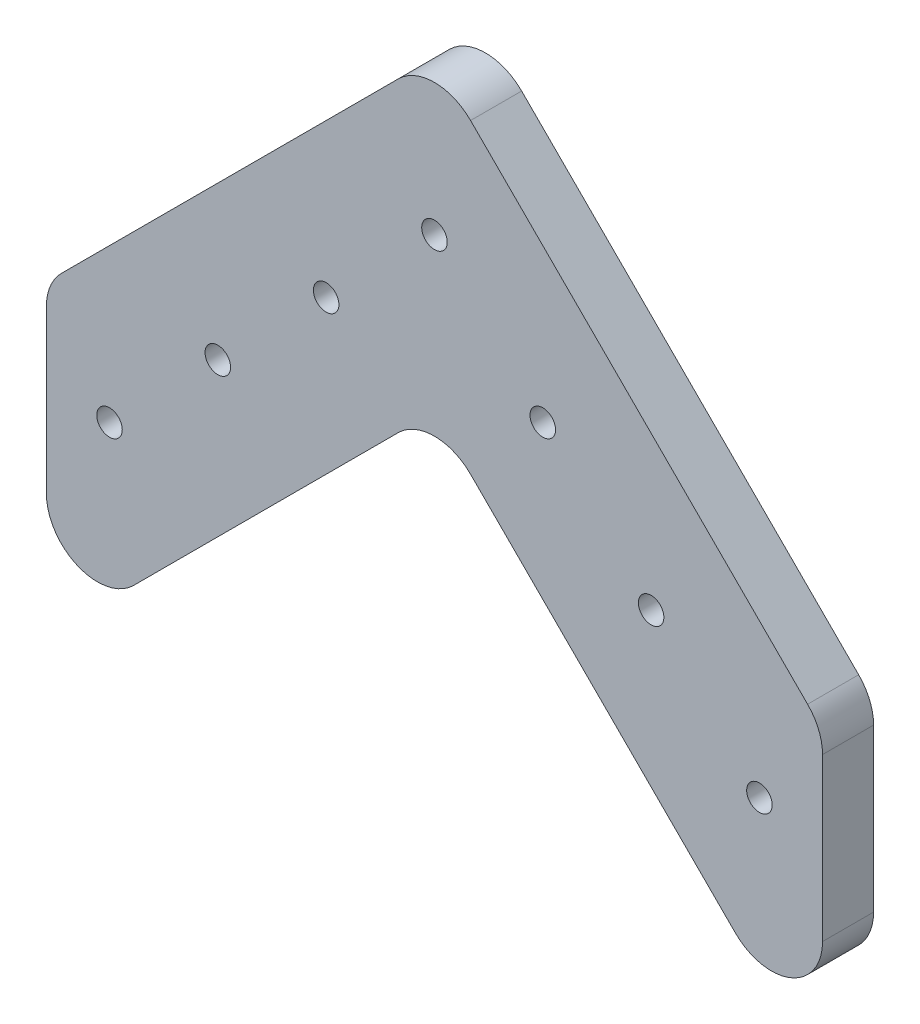
ISO-10303-21;
HEADER;
FILE_DESCRIPTION(('STEP AP214'),'2;1');
FILE_NAME('part.step','',(''),(''),'','','');
FILE_SCHEMA(('AUTOMOTIVE_DESIGN { 1 0 10303 214 1 1 1 1 }'));
ENDSEC;
DATA;
#1=APPLICATION_CONTEXT('core data for automotive mechanical design processes');
#2=APPLICATION_PROTOCOL_DEFINITION('international standard','automotive_design',2000,#1);
#3=PRODUCT_CONTEXT('',#1,'mechanical');
#4=PRODUCT('Part','Part','',(#3));
#5=PRODUCT_RELATED_PRODUCT_CATEGORY('part','',(#4));
#6=PRODUCT_DEFINITION_FORMATION('','',#4);
#7=PRODUCT_DEFINITION_CONTEXT('part definition',#1,'design');
#8=PRODUCT_DEFINITION('design','',#6,#7);
#9=PRODUCT_DEFINITION_SHAPE('','',#8);
#10=(LENGTH_UNIT() NAMED_UNIT(*) SI_UNIT(.MILLI.,.METRE.));
#11=(NAMED_UNIT(*) PLANE_ANGLE_UNIT() SI_UNIT($,.RADIAN.));
#12=(NAMED_UNIT(*) SI_UNIT($,.STERADIAN.) SOLID_ANGLE_UNIT());
#13=UNCERTAINTY_MEASURE_WITH_UNIT(LENGTH_MEASURE(1.E-05),#10,'distance_accuracy_value','');
#14=(GEOMETRIC_REPRESENTATION_CONTEXT(3) GLOBAL_UNCERTAINTY_ASSIGNED_CONTEXT((#13)) GLOBAL_UNIT_ASSIGNED_CONTEXT((#10,
#11,#12)) REPRESENTATION_CONTEXT('',''));
#15=CARTESIAN_POINT('',(0.,0.,0.));
#16=DIRECTION('',(0.,0.,1.));
#17=DIRECTION('',(1.,0.,0.));
#18=AXIS2_PLACEMENT_3D('',#15,#16,#17);
#19=CARTESIAN_POINT('',(0.,0.,5.));
#20=DIRECTION('',(0.,0.,-1.));
#21=DIRECTION('',(-1.,0.,0.));
#22=AXIS2_PLACEMENT_3D('',#19,#20,#21);
#23=PLANE('',#22);
#24=DIRECTION('',(0.,-1.,0.));
#25=VECTOR('',#24,1.);
#26=CARTESIAN_POINT('',(-38.,74.8284271247462,5.));
#27=LINE('',#26,#25);
#28=CARTESIAN_POINT('',(-38.,102.757359312881,5.));
#29=VERTEX_POINT('',#28);
#30=CARTESIAN_POINT('',(-38.,86.8994949366117,5.));
#31=VERTEX_POINT('',#30);
#32=EDGE_CURVE('E162',#29,#31,#27,.T.);
#33=ORIENTED_EDGE('',*,*,#32,.T.);
#34=CARTESIAN_POINT('',(-33.,86.8994949366117,5.));
#35=DIRECTION('',(0.,0.,-1.));
#36=DIRECTION('',(-1.,0.,0.));
#37=AXIS2_PLACEMENT_3D('',#34,#35,#36);
#38=CIRCLE('',#37,5.);
#39=CARTESIAN_POINT('',(-29.4644660940673,83.3639610306789,5.));
#40=VERTEX_POINT('',#39);
#41=EDGE_CURVE('E189',#31,#40,#38,.F.);
#42=ORIENTED_EDGE('',*,*,#41,.T.);
#43=DIRECTION('',(0.707106781186548,0.707106781186548,0.));
#44=VECTOR('',#43,1.);
#45=CARTESIAN_POINT('',(-38.,74.8284271247462,5.));
#46=LINE('',#45,#44);
#47=CARTESIAN_POINT('',(-3.53553390593272,109.292893218813,5.));
#48=VERTEX_POINT('',#47);
#49=EDGE_CURVE('E219',#40,#48,#46,.T.);
#50=ORIENTED_EDGE('',*,*,#49,.T.);
#51=CARTESIAN_POINT('',(0.,105.757359312881,5.));
#52=DIRECTION('',(0.,0.,-1.));
#53=DIRECTION('',(-1.,0.,0.));
#54=AXIS2_PLACEMENT_3D('',#51,#52,#53);
#55=CIRCLE('',#54,5.);
#56=CARTESIAN_POINT('',(3.53553390593273,109.292893218813,5.));
#57=VERTEX_POINT('',#56);
#58=EDGE_CURVE('E11',#48,#57,#55,.T.);
#59=ORIENTED_EDGE('',*,*,#58,.T.);
#60=DIRECTION('',(0.707106781186548,-0.707106781186547,0.));
#61=VECTOR('',#60,1.);
#62=CARTESIAN_POINT('',(38.,74.8284271247462,5.));
#63=LINE('',#62,#61);
#64=CARTESIAN_POINT('',(29.4644660940672,83.363961030679,5.));
#65=VERTEX_POINT('',#64);
#66=EDGE_CURVE('E140',#57,#65,#63,.T.);
#67=ORIENTED_EDGE('',*,*,#66,.T.);
#68=CARTESIAN_POINT('',(33.,86.8994949366117,5.));
#69=DIRECTION('',(0.,0.,-1.));
#70=DIRECTION('',(-1.,0.,0.));
#71=AXIS2_PLACEMENT_3D('',#68,#69,#70);
#72=CIRCLE('',#71,5.);
#73=CARTESIAN_POINT('',(38.,86.8994949366117,5.));
#74=VERTEX_POINT('',#73);
#75=EDGE_CURVE('E187',#65,#74,#72,.F.);
#76=ORIENTED_EDGE('',*,*,#75,.T.);
#77=DIRECTION('',(0.,1.,0.));
#78=VECTOR('',#77,1.);
#79=CARTESIAN_POINT('',(38.,74.8284271247462,5.));
#80=LINE('',#79,#78);
#81=CARTESIAN_POINT('',(38.,102.757359312881,5.));
#82=VERTEX_POINT('',#81);
#83=EDGE_CURVE('E228',#74,#82,#80,.T.);
#84=ORIENTED_EDGE('',*,*,#83,.T.);
#85=CARTESIAN_POINT('',(33.,102.757359312881,5.));
#86=DIRECTION('',(0.,0.,-1.));
#87=DIRECTION('',(-1.,0.,0.));
#88=AXIS2_PLACEMENT_3D('',#85,#86,#87);
#89=CIRCLE('',#88,5.);
#90=CARTESIAN_POINT('',(36.5355339059327,106.292893218813,5.));
#91=VERTEX_POINT('',#90);
#92=EDGE_CURVE('E185',#82,#91,#89,.F.);
#93=ORIENTED_EDGE('',*,*,#92,.T.);
#94=DIRECTION('',(-0.707106781186548,0.707106781186547,0.));
#95=VECTOR('',#94,1.);
#96=CARTESIAN_POINT('',(38.,104.828427124746,5.));
#97=LINE('',#96,#95);
#98=CARTESIAN_POINT('',(3.53553390593272,139.292893218813,5.));
#99=VERTEX_POINT('',#98);
#100=EDGE_CURVE('E231',#91,#99,#97,.T.);
#101=ORIENTED_EDGE('',*,*,#100,.T.);
#102=CARTESIAN_POINT('',(0.,135.757359312881,5.));
#103=DIRECTION('',(0.,0.,-1.));
#104=DIRECTION('',(-1.,0.,0.));
#105=AXIS2_PLACEMENT_3D('',#102,#103,#104);
#106=CIRCLE('',#105,5.);
#107=CARTESIAN_POINT('',(-3.53553390593276,139.292893218813,5.));
#108=VERTEX_POINT('',#107);
#109=EDGE_CURVE('E55',#99,#108,#106,.F.);
#110=ORIENTED_EDGE('',*,*,#109,.T.);
#111=DIRECTION('',(-0.707106781186547,-0.707106781186548,0.));
#112=VECTOR('',#111,1.);
#113=CARTESIAN_POINT('',(-38.,104.828427124746,5.));
#114=LINE('',#113,#112);
#115=CARTESIAN_POINT('',(-36.5355339059327,106.292893218813,5.));
#116=VERTEX_POINT('',#115);
#117=EDGE_CURVE('E163',#108,#116,#114,.T.);
#118=ORIENTED_EDGE('',*,*,#117,.T.);
#119=CARTESIAN_POINT('',(-33.,102.757359312881,5.));
#120=DIRECTION('',(0.,0.,-1.));
#121=DIRECTION('',(-1.,0.,0.));
#122=AXIS2_PLACEMENT_3D('',#119,#120,#121);
#123=CIRCLE('',#122,5.);
#124=EDGE_CURVE('E182',#116,#29,#123,.F.);
#125=ORIENTED_EDGE('',*,*,#124,.T.);
#126=EDGE_LOOP('',(#33,#42,#50,#59,#67,#76,#84,#93,#101,#110,#118,#125));
#127=FACE_BOUND('',#126,.T.);
#128=CARTESIAN_POINT('',(-31.8198051533946,96.0086219713515,5.));
#129=DIRECTION('',(0.,0.,1.));
#130=DIRECTION('',(1.,0.,0.));
#131=AXIS2_PLACEMENT_3D('',#128,#129,#130);
#132=CIRCLE('',#131,1.25);
#133=CARTESIAN_POINT('',(-30.5698051533946,96.0086219713515,5.));
#134=VERTEX_POINT('',#133);
#135=EDGE_CURVE('E233',#134,#134,#132,.T.);
#136=ORIENTED_EDGE('',*,*,#135,.F.);
#137=EDGE_LOOP('',(#136));
#138=FACE_BOUND('',#137,.T.);
#139=CARTESIAN_POINT('',(-21.2132034355964,106.61522368915,5.));
#140=DIRECTION('',(0.,0.,1.));
#141=DIRECTION('',(1.,0.,0.));
#142=AXIS2_PLACEMENT_3D('',#139,#140,#141);
#143=CIRCLE('',#142,1.25);
#144=CARTESIAN_POINT('',(-19.9632034355964,106.61522368915,5.));
#145=VERTEX_POINT('',#144);
#146=EDGE_CURVE('E238',#145,#145,#143,.T.);
#147=ORIENTED_EDGE('',*,*,#146,.F.);
#148=EDGE_LOOP('',(#147));
#149=FACE_BOUND('',#148,.T.);
#150=CARTESIAN_POINT('',(-10.6066017177982,117.221825406948,5.));
#151=DIRECTION('',(0.,0.,1.));
#152=DIRECTION('',(1.,0.,0.));
#153=AXIS2_PLACEMENT_3D('',#150,#151,#152);
#154=CIRCLE('',#153,1.25);
#155=CARTESIAN_POINT('',(-9.35660171779822,117.221825406948,5.));
#156=VERTEX_POINT('',#155);
#157=EDGE_CURVE('E243',#156,#156,#154,.T.);
#158=ORIENTED_EDGE('',*,*,#157,.F.);
#159=EDGE_LOOP('',(#158));
#160=FACE_BOUND('',#159,.T.);
#161=CARTESIAN_POINT('',(0.,127.828427124746,5.));
#162=DIRECTION('',(0.,0.,1.));
#163=DIRECTION('',(1.,0.,0.));
#164=AXIS2_PLACEMENT_3D('',#161,#162,#163);
#165=CIRCLE('',#164,1.25);
#166=CARTESIAN_POINT('',(1.25,127.828427124746,5.));
#167=VERTEX_POINT('',#166);
#168=EDGE_CURVE('E249',#167,#167,#165,.T.);
#169=ORIENTED_EDGE('',*,*,#168,.F.);
#170=EDGE_LOOP('',(#169));
#171=FACE_BOUND('',#170,.T.);
#172=CARTESIAN_POINT('',(10.6066017177982,117.221825406948,5.));
#173=DIRECTION('',(0.,0.,1.));
#174=DIRECTION('',(-1.,0.,0.));
#175=AXIS2_PLACEMENT_3D('',#172,#173,#174);
#176=CIRCLE('',#175,1.25);
#177=CARTESIAN_POINT('',(9.35660171779822,117.221825406948,5.));
#178=VERTEX_POINT('',#177);
#179=EDGE_CURVE('E255',#178,#178,#176,.T.);
#180=ORIENTED_EDGE('',*,*,#179,.F.);
#181=EDGE_LOOP('',(#180));
#182=FACE_BOUND('',#181,.T.);
#183=CARTESIAN_POINT('',(21.2132034355964,106.61522368915,5.));
#184=DIRECTION('',(0.,0.,1.));
#185=DIRECTION('',(-1.,0.,0.));
#186=AXIS2_PLACEMENT_3D('',#183,#184,#185);
#187=CIRCLE('',#186,1.25);
#188=CARTESIAN_POINT('',(19.9632034355964,106.61522368915,5.));
#189=VERTEX_POINT('',#188);
#190=EDGE_CURVE('E261',#189,#189,#187,.T.);
#191=ORIENTED_EDGE('',*,*,#190,.F.);
#192=EDGE_LOOP('',(#191));
#193=FACE_BOUND('',#192,.T.);
#194=CARTESIAN_POINT('',(31.8198051533946,96.0086219713515,5.));
#195=DIRECTION('',(0.,0.,1.));
#196=DIRECTION('',(-1.,0.,0.));
#197=AXIS2_PLACEMENT_3D('',#194,#195,#196);
#198=CIRCLE('',#197,1.25000000000001);
#199=CARTESIAN_POINT('',(30.5698051533946,96.0086219713515,5.));
#200=VERTEX_POINT('',#199);
#201=EDGE_CURVE('E267',#200,#200,#198,.T.);
#202=ORIENTED_EDGE('',*,*,#201,.F.);
#203=EDGE_LOOP('',(#202));
#204=FACE_BOUND('',#203,.T.);
#205=ADVANCED_FACE('F33',(#127,#138,#149,#160,#171,#182,#193,#204),#23,.F.);
#206=CARTESIAN_POINT('',(0.,0.,0.));
#207=DIRECTION('',(0.,0.,-1.));
#208=DIRECTION('',(-1.,0.,0.));
#209=AXIS2_PLACEMENT_3D('',#206,#207,#208);
#210=PLANE('',#209);
#211=CARTESIAN_POINT('',(21.2132034355964,106.61522368915,0.));
#212=DIRECTION('',(0.,0.,1.));
#213=DIRECTION('',(-1.,0.,0.));
#214=AXIS2_PLACEMENT_3D('',#211,#212,#213);
#215=CIRCLE('',#214,1.25);
#216=CARTESIAN_POINT('',(19.9632034355964,106.61522368915,0.));
#217=VERTEX_POINT('',#216);
#218=EDGE_CURVE('E264',#217,#217,#215,.T.);
#219=ORIENTED_EDGE('',*,*,#218,.T.);
#220=EDGE_LOOP('',(#219));
#221=FACE_BOUND('',#220,.T.);
#222=CARTESIAN_POINT('',(0.,127.828427124746,0.));
#223=DIRECTION('',(0.,0.,1.));
#224=DIRECTION('',(1.,0.,0.));
#225=AXIS2_PLACEMENT_3D('',#222,#223,#224);
#226=CIRCLE('',#225,1.25);
#227=CARTESIAN_POINT('',(1.25,127.828427124746,0.));
#228=VERTEX_POINT('',#227);
#229=EDGE_CURVE('E252',#228,#228,#226,.T.);
#230=ORIENTED_EDGE('',*,*,#229,.T.);
#231=EDGE_LOOP('',(#230));
#232=FACE_BOUND('',#231,.T.);
#233=CARTESIAN_POINT('',(-21.2132034355964,106.61522368915,0.));
#234=DIRECTION('',(0.,0.,1.));
#235=DIRECTION('',(1.,0.,0.));
#236=AXIS2_PLACEMENT_3D('',#233,#234,#235);
#237=CIRCLE('',#236,1.25);
#238=CARTESIAN_POINT('',(-19.9632034355964,106.61522368915,0.));
#239=VERTEX_POINT('',#238);
#240=EDGE_CURVE('E240',#239,#239,#237,.T.);
#241=ORIENTED_EDGE('',*,*,#240,.T.);
#242=EDGE_LOOP('',(#241));
#243=FACE_BOUND('',#242,.T.);
#244=DIRECTION('',(0.707106781186548,0.707106781186548,0.));
#245=VECTOR('',#244,1.);
#246=CARTESIAN_POINT('',(-38.,74.8284271247462,0.));
#247=LINE('',#246,#245);
#248=CARTESIAN_POINT('',(-29.4644660940673,83.3639610306789,0.));
#249=VERTEX_POINT('',#248);
#250=CARTESIAN_POINT('',(-3.53553390593272,109.292893218813,0.));
#251=VERTEX_POINT('',#250);
#252=EDGE_CURVE('E149',#249,#251,#247,.T.);
#253=ORIENTED_EDGE('',*,*,#252,.F.);
#254=CARTESIAN_POINT('',(-33.,86.8994949366117,0.));
#255=DIRECTION('',(0.,0.,-1.));
#256=DIRECTION('',(-1.,0.,0.));
#257=AXIS2_PLACEMENT_3D('',#254,#255,#256);
#258=CIRCLE('',#257,5.);
#259=CARTESIAN_POINT('',(-38.,86.8994949366117,0.));
#260=VERTEX_POINT('',#259);
#261=EDGE_CURVE('E175',#249,#260,#258,.T.);
#262=ORIENTED_EDGE('',*,*,#261,.T.);
#263=DIRECTION('',(0.,-1.,0.));
#264=VECTOR('',#263,1.);
#265=CARTESIAN_POINT('',(-38.,74.8284271247462,0.));
#266=LINE('',#265,#264);
#267=CARTESIAN_POINT('',(-38.,102.757359312881,0.));
#268=VERTEX_POINT('',#267);
#269=EDGE_CURVE('E154',#268,#260,#266,.T.);
#270=ORIENTED_EDGE('',*,*,#269,.F.);
#271=CARTESIAN_POINT('',(-33.,102.757359312881,0.));
#272=DIRECTION('',(0.,0.,-1.));
#273=DIRECTION('',(-1.,0.,0.));
#274=AXIS2_PLACEMENT_3D('',#271,#272,#273);
#275=CIRCLE('',#274,5.);
#276=CARTESIAN_POINT('',(-36.5355339059327,106.292893218813,0.));
#277=VERTEX_POINT('',#276);
#278=EDGE_CURVE('E168',#268,#277,#275,.T.);
#279=ORIENTED_EDGE('',*,*,#278,.T.);
#280=DIRECTION('',(-0.707106781186547,-0.707106781186548,0.));
#281=VECTOR('',#280,1.);
#282=CARTESIAN_POINT('',(-38.,104.828427124746,0.));
#283=LINE('',#282,#281);
#284=CARTESIAN_POINT('',(-3.53553390593276,139.292893218813,0.));
#285=VERTEX_POINT('',#284);
#286=EDGE_CURVE('E160',#285,#277,#283,.T.);
#287=ORIENTED_EDGE('',*,*,#286,.F.);
#288=CARTESIAN_POINT('',(0.,135.757359312881,0.));
#289=DIRECTION('',(0.,0.,-1.));
#290=DIRECTION('',(-1.,0.,0.));
#291=AXIS2_PLACEMENT_3D('',#288,#289,#290);
#292=CIRCLE('',#291,5.);
#293=CARTESIAN_POINT('',(3.53553390593272,139.292893218813,0.));
#294=VERTEX_POINT('',#293);
#295=EDGE_CURVE('E170',#285,#294,#292,.T.);
#296=ORIENTED_EDGE('',*,*,#295,.T.);
#297=DIRECTION('',(-0.707106781186548,0.707106781186547,0.));
#298=VECTOR('',#297,1.);
#299=CARTESIAN_POINT('',(38.,104.828427124746,0.));
#300=LINE('',#299,#298);
#301=CARTESIAN_POINT('',(36.5355339059327,106.292893218813,0.));
#302=VERTEX_POINT('',#301);
#303=EDGE_CURVE('E152',#302,#294,#300,.T.);
#304=ORIENTED_EDGE('',*,*,#303,.F.);
#305=CARTESIAN_POINT('',(33.,102.757359312881,0.));
#306=DIRECTION('',(0.,0.,-1.));
#307=DIRECTION('',(-1.,0.,0.));
#308=AXIS2_PLACEMENT_3D('',#305,#306,#307);
#309=CIRCLE('',#308,5.);
#310=CARTESIAN_POINT('',(38.,102.757359312881,0.));
#311=VERTEX_POINT('',#310);
#312=EDGE_CURVE('E172',#302,#311,#309,.T.);
#313=ORIENTED_EDGE('',*,*,#312,.T.);
#314=DIRECTION('',(0.,1.,0.));
#315=VECTOR('',#314,1.);
#316=CARTESIAN_POINT('',(38.,74.8284271247462,0.));
#317=LINE('',#316,#315);
#318=CARTESIAN_POINT('',(38.,86.8994949366117,0.));
#319=VERTEX_POINT('',#318);
#320=EDGE_CURVE('E148',#319,#311,#317,.T.);
#321=ORIENTED_EDGE('',*,*,#320,.F.);
#322=CARTESIAN_POINT('',(33.,86.8994949366117,0.));
#323=DIRECTION('',(0.,0.,-1.));
#324=DIRECTION('',(-1.,0.,0.));
#325=AXIS2_PLACEMENT_3D('',#322,#323,#324);
#326=CIRCLE('',#325,5.);
#327=CARTESIAN_POINT('',(29.4644660940672,83.363961030679,0.));
#328=VERTEX_POINT('',#327);
#329=EDGE_CURVE('E147',#319,#328,#326,.T.);
#330=ORIENTED_EDGE('',*,*,#329,.T.);
#331=DIRECTION('',(0.707106781186548,-0.707106781186547,0.));
#332=VECTOR('',#331,1.);
#333=CARTESIAN_POINT('',(38.,74.8284271247462,0.));
#334=LINE('',#333,#332);
#335=CARTESIAN_POINT('',(3.53553390593273,109.292893218813,0.));
#336=VERTEX_POINT('',#335);
#337=EDGE_CURVE('E137',#336,#328,#334,.T.);
#338=ORIENTED_EDGE('',*,*,#337,.F.);
#339=CARTESIAN_POINT('',(0.,105.757359312881,0.));
#340=DIRECTION('',(0.,0.,-1.));
#341=DIRECTION('',(-1.,0.,0.));
#342=AXIS2_PLACEMENT_3D('',#339,#340,#341);
#343=CIRCLE('',#342,5.);
#344=EDGE_CURVE('E41',#336,#251,#343,.F.);
#345=ORIENTED_EDGE('',*,*,#344,.T.);
#346=EDGE_LOOP('',(#253,#262,#270,#279,#287,#296,#304,#313,#321,#330,#338,#345));
#347=FACE_BOUND('',#346,.T.);
#348=CARTESIAN_POINT('',(-31.8198051533946,96.0086219713515,0.));
#349=DIRECTION('',(0.,0.,1.));
#350=DIRECTION('',(1.,0.,0.));
#351=AXIS2_PLACEMENT_3D('',#348,#349,#350);
#352=CIRCLE('',#351,1.25);
#353=CARTESIAN_POINT('',(-30.5698051533946,96.0086219713515,0.));
#354=VERTEX_POINT('',#353);
#355=EDGE_CURVE('E224',#354,#354,#352,.T.);
#356=ORIENTED_EDGE('',*,*,#355,.T.);
#357=EDGE_LOOP('',(#356));
#358=FACE_BOUND('',#357,.T.);
#359=CARTESIAN_POINT('',(-10.6066017177982,117.221825406948,0.));
#360=DIRECTION('',(0.,0.,1.));
#361=DIRECTION('',(1.,0.,0.));
#362=AXIS2_PLACEMENT_3D('',#359,#360,#361);
#363=CIRCLE('',#362,1.25);
#364=CARTESIAN_POINT('',(-9.35660171779822,117.221825406948,0.));
#365=VERTEX_POINT('',#364);
#366=EDGE_CURVE('E246',#365,#365,#363,.T.);
#367=ORIENTED_EDGE('',*,*,#366,.T.);
#368=EDGE_LOOP('',(#367));
#369=FACE_BOUND('',#368,.T.);
#370=CARTESIAN_POINT('',(10.6066017177982,117.221825406948,0.));
#371=DIRECTION('',(0.,0.,1.));
#372=DIRECTION('',(-1.,0.,0.));
#373=AXIS2_PLACEMENT_3D('',#370,#371,#372);
#374=CIRCLE('',#373,1.25);
#375=CARTESIAN_POINT('',(9.35660171779822,117.221825406948,0.));
#376=VERTEX_POINT('',#375);
#377=EDGE_CURVE('E258',#376,#376,#374,.T.);
#378=ORIENTED_EDGE('',*,*,#377,.T.);
#379=EDGE_LOOP('',(#378));
#380=FACE_BOUND('',#379,.T.);
#381=CARTESIAN_POINT('',(31.8198051533946,96.0086219713515,0.));
#382=DIRECTION('',(0.,0.,1.));
#383=DIRECTION('',(-1.,0.,0.));
#384=AXIS2_PLACEMENT_3D('',#381,#382,#383);
#385=CIRCLE('',#384,1.25000000000001);
#386=CARTESIAN_POINT('',(30.5698051533946,96.0086219713515,0.));
#387=VERTEX_POINT('',#386);
#388=EDGE_CURVE('E270',#387,#387,#385,.T.);
#389=ORIENTED_EDGE('',*,*,#388,.T.);
#390=EDGE_LOOP('',(#389));
#391=FACE_BOUND('',#390,.T.);
#392=ADVANCED_FACE('F144',(#221,#232,#243,#347,#358,#369,#380,#391),#210,.T.);
#393=CARTESIAN_POINT('',(-38.,74.8284271247462,5.));
#394=DIRECTION('',(1.,0.,0.));
#395=DIRECTION('',(0.,0.,-1.));
#396=AXIS2_PLACEMENT_3D('',#393,#394,#395);
#397=PLANE('',#396);
#398=ORIENTED_EDGE('',*,*,#269,.T.);
#399=DIRECTION('',(0.,0.,-1.));
#400=VECTOR('',#399,1.);
#401=CARTESIAN_POINT('',(-38.,86.8994949366117,5.));
#402=LINE('',#401,#400);
#403=EDGE_CURVE('E180',#260,#31,#402,.F.);
#404=ORIENTED_EDGE('',*,*,#403,.T.);
#405=ORIENTED_EDGE('',*,*,#32,.F.);
#406=DIRECTION('',(0.,0.,-1.));
#407=VECTOR('',#406,1.);
#408=CARTESIAN_POINT('',(-38.,102.757359312881,5.));
#409=LINE('',#408,#407);
#410=EDGE_CURVE('E177',#29,#268,#409,.T.);
#411=ORIENTED_EDGE('',*,*,#410,.T.);
#412=EDGE_LOOP('',(#398,#404,#405,#411));
#413=FACE_BOUND('',#412,.T.);
#414=ADVANCED_FACE('F215',(#413),#397,.F.);
#415=CARTESIAN_POINT('',(-38.,74.8284271247462,5.));
#416=DIRECTION('',(-0.707106781186548,0.707106781186548,0.));
#417=DIRECTION('',(-0.707106781186548,-0.707106781186548,0.));
#418=AXIS2_PLACEMENT_3D('',#415,#416,#417);
#419=PLANE('',#418);
#420=ORIENTED_EDGE('',*,*,#252,.T.);
#421=DIRECTION('',(0.,0.,-1.));
#422=VECTOR('',#421,1.);
#423=CARTESIAN_POINT('',(-3.53553390593274,109.292893218813,5.));
#424=LINE('',#423,#422);
#425=EDGE_CURVE('E127',#251,#48,#424,.F.);
#426=ORIENTED_EDGE('',*,*,#425,.T.);
#427=ORIENTED_EDGE('',*,*,#49,.F.);
#428=DIRECTION('',(0.,0.,-1.));
#429=VECTOR('',#428,1.);
#430=CARTESIAN_POINT('',(-29.4644660940673,83.3639610306789,5.));
#431=LINE('',#430,#429);
#432=EDGE_CURVE('E141',#40,#249,#431,.T.);
#433=ORIENTED_EDGE('',*,*,#432,.T.);
#434=EDGE_LOOP('',(#420,#426,#427,#433));
#435=FACE_BOUND('',#434,.T.);
#436=ADVANCED_FACE('F303',(#435),#419,.F.);
#437=CARTESIAN_POINT('',(38.,74.8284271247462,5.));
#438=DIRECTION('',(0.707106781186547,0.707106781186548,0.));
#439=DIRECTION('',(-0.707106781186548,0.707106781186547,0.));
#440=AXIS2_PLACEMENT_3D('',#437,#438,#439);
#441=PLANE('',#440);
#442=ORIENTED_EDGE('',*,*,#66,.F.);
#443=DIRECTION('',(0.,0.,-1.));
#444=VECTOR('',#443,1.);
#445=CARTESIAN_POINT('',(3.53553390593274,109.292893218813,0.));
#446=LINE('',#445,#444);
#447=EDGE_CURVE('E126',#57,#336,#446,.T.);
#448=ORIENTED_EDGE('',*,*,#447,.T.);
#449=ORIENTED_EDGE('',*,*,#337,.T.);
#450=DIRECTION('',(0.,0.,-1.));
#451=VECTOR('',#450,1.);
#452=CARTESIAN_POINT('',(29.4644660940673,83.363961030679,5.));
#453=LINE('',#452,#451);
#454=EDGE_CURVE('E142',#328,#65,#453,.F.);
#455=ORIENTED_EDGE('',*,*,#454,.T.);
#456=EDGE_LOOP('',(#442,#448,#449,#455));
#457=FACE_BOUND('',#456,.T.);
#458=ADVANCED_FACE('F136',(#457),#441,.F.);
#459=CARTESIAN_POINT('',(38.,74.8284271247462,5.));
#460=DIRECTION('',(-1.,0.,0.));
#461=DIRECTION('',(0.,-1.,0.));
#462=AXIS2_PLACEMENT_3D('',#459,#460,#461);
#463=PLANE('',#462);
#464=ORIENTED_EDGE('',*,*,#83,.F.);
#465=DIRECTION('',(0.,0.,-1.));
#466=VECTOR('',#465,1.);
#467=CARTESIAN_POINT('',(38.,86.8994949366117,5.));
#468=LINE('',#467,#466);
#469=EDGE_CURVE('E193',#74,#319,#468,.T.);
#470=ORIENTED_EDGE('',*,*,#469,.T.);
#471=ORIENTED_EDGE('',*,*,#320,.T.);
#472=DIRECTION('',(0.,0.,-1.));
#473=VECTOR('',#472,1.);
#474=CARTESIAN_POINT('',(38.,102.757359312881,5.));
#475=LINE('',#474,#473);
#476=EDGE_CURVE('E191',#311,#82,#475,.F.);
#477=ORIENTED_EDGE('',*,*,#476,.T.);
#478=EDGE_LOOP('',(#464,#470,#471,#477));
#479=FACE_BOUND('',#478,.T.);
#480=ADVANCED_FACE('F296',(#479),#463,.F.);
#481=CARTESIAN_POINT('',(38.,104.828427124746,5.));
#482=DIRECTION('',(-0.707106781186547,-0.707106781186548,0.));
#483=DIRECTION('',(0.707106781186548,-0.707106781186547,0.));
#484=AXIS2_PLACEMENT_3D('',#481,#482,#483);
#485=PLANE('',#484);
#486=ORIENTED_EDGE('',*,*,#100,.F.);
#487=DIRECTION('',(0.,0.,-1.));
#488=VECTOR('',#487,1.);
#489=CARTESIAN_POINT('',(36.5355339059327,106.292893218813,5.));
#490=LINE('',#489,#488);
#491=EDGE_CURVE('E198',#91,#302,#490,.T.);
#492=ORIENTED_EDGE('',*,*,#491,.T.);
#493=ORIENTED_EDGE('',*,*,#303,.T.);
#494=DIRECTION('',(0.,0.,-1.));
#495=VECTOR('',#494,1.);
#496=CARTESIAN_POINT('',(3.53553390593273,139.292893218813,5.));
#497=LINE('',#496,#495);
#498=EDGE_CURVE('E196',#294,#99,#497,.F.);
#499=ORIENTED_EDGE('',*,*,#498,.T.);
#500=EDGE_LOOP('',(#486,#492,#493,#499));
#501=FACE_BOUND('',#500,.T.);
#502=ADVANCED_FACE('F293',(#501),#485,.F.);
#503=CARTESIAN_POINT('',(-38.,104.828427124746,5.));
#504=DIRECTION('',(0.707106781186548,-0.707106781186547,0.));
#505=DIRECTION('',(0.707106781186547,0.707106781186548,0.));
#506=AXIS2_PLACEMENT_3D('',#503,#504,#505);
#507=PLANE('',#506);
#508=ORIENTED_EDGE('',*,*,#117,.F.);
#509=DIRECTION('',(0.,0.,-1.));
#510=VECTOR('',#509,1.);
#511=CARTESIAN_POINT('',(-3.53553390593276,139.292893218813,5.));
#512=LINE('',#511,#510);
#513=EDGE_CURVE('E132',#108,#285,#512,.T.);
#514=ORIENTED_EDGE('',*,*,#513,.T.);
#515=ORIENTED_EDGE('',*,*,#286,.T.);
#516=DIRECTION('',(0.,0.,-1.));
#517=VECTOR('',#516,1.);
#518=CARTESIAN_POINT('',(-36.5355339059327,106.292893218813,5.));
#519=LINE('',#518,#517);
#520=EDGE_CURVE('E48',#277,#116,#519,.F.);
#521=ORIENTED_EDGE('',*,*,#520,.T.);
#522=EDGE_LOOP('',(#508,#514,#515,#521));
#523=FACE_BOUND('',#522,.T.);
#524=ADVANCED_FACE('F205',(#523),#507,.F.);
#525=CARTESIAN_POINT('',(-31.8198051533946,96.0086219713515,5.));
#526=DIRECTION('',(0.,0.,-1.));
#527=DIRECTION('',(-1.,0.,0.));
#528=AXIS2_PLACEMENT_3D('',#525,#526,#527);
#529=CYLINDRICAL_SURFACE('',#528,1.25);
#530=ORIENTED_EDGE('',*,*,#135,.T.);
#531=EDGE_LOOP('',(#530));
#532=FACE_BOUND('',#531,.T.);
#533=ORIENTED_EDGE('',*,*,#355,.F.);
#534=EDGE_LOOP('',(#533));
#535=FACE_BOUND('',#534,.T.);
#536=ADVANCED_FACE('F288',(#532,#535),#529,.F.);
#537=CARTESIAN_POINT('',(-21.2132034355964,106.61522368915,5.));
#538=DIRECTION('',(0.,0.,-1.));
#539=DIRECTION('',(-1.,0.,0.));
#540=AXIS2_PLACEMENT_3D('',#537,#538,#539);
#541=CYLINDRICAL_SURFACE('',#540,1.25);
#542=ORIENTED_EDGE('',*,*,#146,.T.);
#543=EDGE_LOOP('',(#542));
#544=FACE_BOUND('',#543,.T.);
#545=ORIENTED_EDGE('',*,*,#240,.F.);
#546=EDGE_LOOP('',(#545));
#547=FACE_BOUND('',#546,.T.);
#548=ADVANCED_FACE('F463',(#544,#547),#541,.F.);
#549=CARTESIAN_POINT('',(-10.6066017177982,117.221825406948,5.));
#550=DIRECTION('',(0.,0.,-1.));
#551=DIRECTION('',(-1.,0.,0.));
#552=AXIS2_PLACEMENT_3D('',#549,#550,#551);
#553=CYLINDRICAL_SURFACE('',#552,1.25);
#554=ORIENTED_EDGE('',*,*,#157,.T.);
#555=EDGE_LOOP('',(#554));
#556=FACE_BOUND('',#555,.T.);
#557=ORIENTED_EDGE('',*,*,#366,.F.);
#558=EDGE_LOOP('',(#557));
#559=FACE_BOUND('',#558,.T.);
#560=ADVANCED_FACE('F453',(#556,#559),#553,.F.);
#561=CARTESIAN_POINT('',(0.,127.828427124746,5.));
#562=DIRECTION('',(0.,0.,-1.));
#563=DIRECTION('',(-1.,0.,0.));
#564=AXIS2_PLACEMENT_3D('',#561,#562,#563);
#565=CYLINDRICAL_SURFACE('',#564,1.25);
#566=ORIENTED_EDGE('',*,*,#168,.T.);
#567=EDGE_LOOP('',(#566));
#568=FACE_BOUND('',#567,.T.);
#569=ORIENTED_EDGE('',*,*,#229,.F.);
#570=EDGE_LOOP('',(#569));
#571=FACE_BOUND('',#570,.T.);
#572=ADVANCED_FACE('F443',(#568,#571),#565,.F.);
#573=CARTESIAN_POINT('',(10.6066017177982,117.221825406948,5.));
#574=DIRECTION('',(0.,0.,-1.));
#575=DIRECTION('',(-1.,0.,0.));
#576=AXIS2_PLACEMENT_3D('',#573,#574,#575);
#577=CYLINDRICAL_SURFACE('',#576,1.25);
#578=ORIENTED_EDGE('',*,*,#179,.T.);
#579=EDGE_LOOP('',(#578));
#580=FACE_BOUND('',#579,.T.);
#581=ORIENTED_EDGE('',*,*,#377,.F.);
#582=EDGE_LOOP('',(#581));
#583=FACE_BOUND('',#582,.T.);
#584=ADVANCED_FACE('F433',(#580,#583),#577,.F.);
#585=CARTESIAN_POINT('',(21.2132034355964,106.61522368915,5.));
#586=DIRECTION('',(0.,0.,-1.));
#587=DIRECTION('',(-1.,0.,0.));
#588=AXIS2_PLACEMENT_3D('',#585,#586,#587);
#589=CYLINDRICAL_SURFACE('',#588,1.25);
#590=ORIENTED_EDGE('',*,*,#190,.T.);
#591=EDGE_LOOP('',(#590));
#592=FACE_BOUND('',#591,.T.);
#593=ORIENTED_EDGE('',*,*,#218,.F.);
#594=EDGE_LOOP('',(#593));
#595=FACE_BOUND('',#594,.T.);
#596=ADVANCED_FACE('F424',(#592,#595),#589,.F.);
#597=CARTESIAN_POINT('',(31.8198051533946,96.0086219713515,5.));
#598=DIRECTION('',(0.,0.,-1.));
#599=DIRECTION('',(-1.,0.,0.));
#600=AXIS2_PLACEMENT_3D('',#597,#598,#599);
#601=CYLINDRICAL_SURFACE('',#600,1.25000000000001);
#602=ORIENTED_EDGE('',*,*,#201,.T.);
#603=EDGE_LOOP('',(#602));
#604=FACE_BOUND('',#603,.T.);
#605=ORIENTED_EDGE('',*,*,#388,.F.);
#606=EDGE_LOOP('',(#605));
#607=FACE_BOUND('',#606,.T.);
#608=ADVANCED_FACE('F276',(#604,#607),#601,.F.);
#609=CARTESIAN_POINT('',(0.,105.757359312881,5.));
#610=DIRECTION('',(0.,0.,1.));
#611=DIRECTION('',(1.,0.,0.));
#612=AXIS2_PLACEMENT_3D('',#609,#610,#611);
#613=CYLINDRICAL_SURFACE('',#612,5.);
#614=ORIENTED_EDGE('',*,*,#58,.F.);
#615=ORIENTED_EDGE('',*,*,#425,.F.);
#616=ORIENTED_EDGE('',*,*,#344,.F.);
#617=ORIENTED_EDGE('',*,*,#447,.F.);
#618=EDGE_LOOP('',(#614,#615,#616,#617));
#619=FACE_BOUND('',#618,.T.);
#620=ADVANCED_FACE('F125',(#619),#613,.F.);
#621=CARTESIAN_POINT('',(-33.,86.8994949366117,5.));
#622=DIRECTION('',(0.,0.,-1.));
#623=DIRECTION('',(-1.,0.,0.));
#624=AXIS2_PLACEMENT_3D('',#621,#622,#623);
#625=CYLINDRICAL_SURFACE('',#624,5.);
#626=ORIENTED_EDGE('',*,*,#41,.F.);
#627=ORIENTED_EDGE('',*,*,#403,.F.);
#628=ORIENTED_EDGE('',*,*,#261,.F.);
#629=ORIENTED_EDGE('',*,*,#432,.F.);
#630=EDGE_LOOP('',(#626,#627,#628,#629));
#631=FACE_BOUND('',#630,.T.);
#632=ADVANCED_FACE('F311',(#631),#625,.T.);
#633=CARTESIAN_POINT('',(33.,86.8994949366117,5.));
#634=DIRECTION('',(0.,0.,-1.));
#635=DIRECTION('',(-1.,0.,0.));
#636=AXIS2_PLACEMENT_3D('',#633,#634,#635);
#637=CYLINDRICAL_SURFACE('',#636,5.);
#638=ORIENTED_EDGE('',*,*,#75,.F.);
#639=ORIENTED_EDGE('',*,*,#454,.F.);
#640=ORIENTED_EDGE('',*,*,#329,.F.);
#641=ORIENTED_EDGE('',*,*,#469,.F.);
#642=EDGE_LOOP('',(#638,#639,#640,#641));
#643=FACE_BOUND('',#642,.T.);
#644=ADVANCED_FACE('F314',(#643),#637,.T.);
#645=CARTESIAN_POINT('',(33.,102.757359312881,5.));
#646=DIRECTION('',(0.,0.,-1.));
#647=DIRECTION('',(-1.,0.,0.));
#648=AXIS2_PLACEMENT_3D('',#645,#646,#647);
#649=CYLINDRICAL_SURFACE('',#648,5.);
#650=ORIENTED_EDGE('',*,*,#92,.F.);
#651=ORIENTED_EDGE('',*,*,#476,.F.);
#652=ORIENTED_EDGE('',*,*,#312,.F.);
#653=ORIENTED_EDGE('',*,*,#491,.F.);
#654=EDGE_LOOP('',(#650,#651,#652,#653));
#655=FACE_BOUND('',#654,.T.);
#656=ADVANCED_FACE('F318',(#655),#649,.T.);
#657=CARTESIAN_POINT('',(0.,135.757359312881,5.));
#658=DIRECTION('',(0.,0.,-1.));
#659=DIRECTION('',(-1.,0.,0.));
#660=AXIS2_PLACEMENT_3D('',#657,#658,#659);
#661=CYLINDRICAL_SURFACE('',#660,5.);
#662=ORIENTED_EDGE('',*,*,#109,.F.);
#663=ORIENTED_EDGE('',*,*,#498,.F.);
#664=ORIENTED_EDGE('',*,*,#295,.F.);
#665=ORIENTED_EDGE('',*,*,#513,.F.);
#666=EDGE_LOOP('',(#662,#663,#664,#665));
#667=FACE_BOUND('',#666,.T.);
#668=ADVANCED_FACE('F321',(#667),#661,.T.);
#669=CARTESIAN_POINT('',(-33.,102.757359312881,5.));
#670=DIRECTION('',(0.,0.,-1.));
#671=DIRECTION('',(-1.,0.,0.));
#672=AXIS2_PLACEMENT_3D('',#669,#670,#671);
#673=CYLINDRICAL_SURFACE('',#672,5.);
#674=ORIENTED_EDGE('',*,*,#124,.F.);
#675=ORIENTED_EDGE('',*,*,#520,.F.);
#676=ORIENTED_EDGE('',*,*,#278,.F.);
#677=ORIENTED_EDGE('',*,*,#410,.F.);
#678=EDGE_LOOP('',(#674,#675,#676,#677));
#679=FACE_BOUND('',#678,.T.);
#680=ADVANCED_FACE('F35',(#679),#673,.T.);
#681=CLOSED_SHELL('',(#205,#392,#414,#436,#458,#480,#502,#524,#536,#548,#560,#572,#584,#596,
#608,#620,#632,#644,#656,#668,#680));
#682=MANIFOLD_SOLID_BREP('B2',#681);
#683=ADVANCED_BREP_SHAPE_REPRESENTATION('',(#18,#682),#14);
#684=SHAPE_DEFINITION_REPRESENTATION(#9,#683);
ENDSEC;
END-ISO-10303-21;
